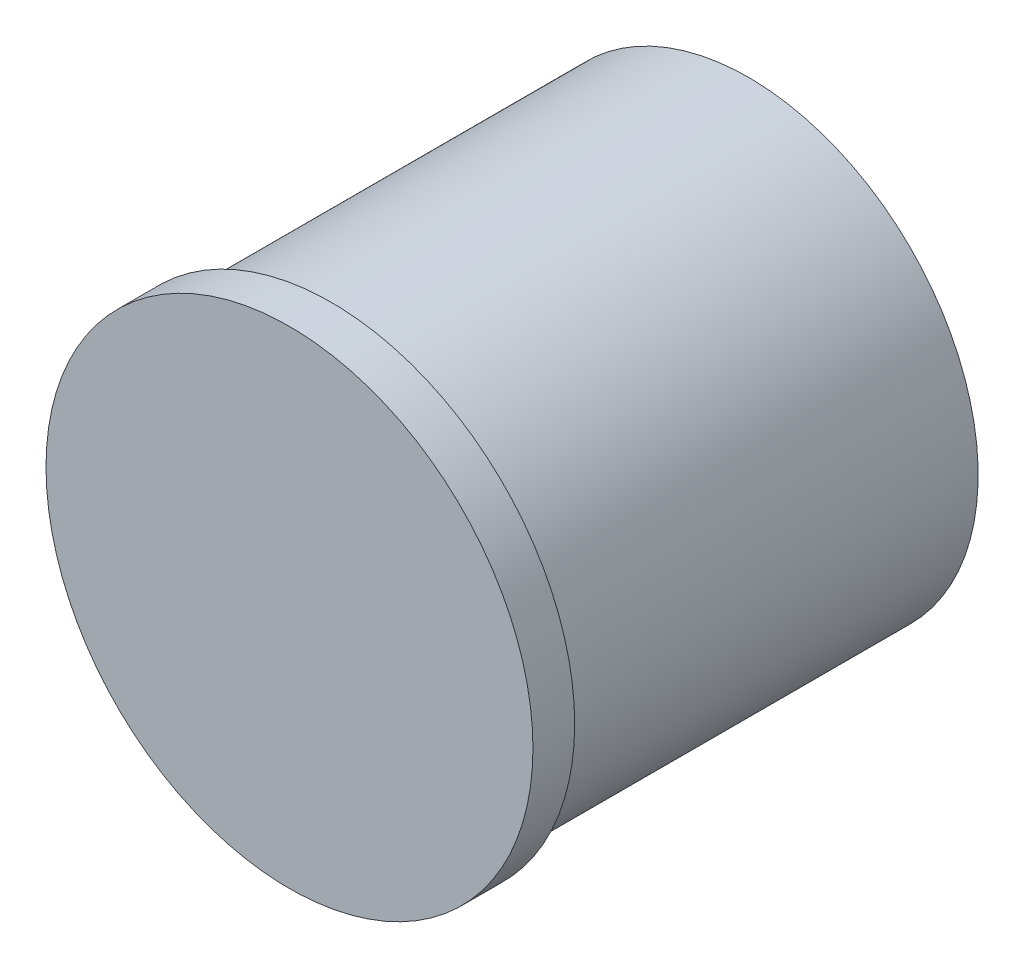
ISO-10303-21;
HEADER;
FILE_DESCRIPTION(('STEP AP214'),'2;1');
FILE_NAME('part.step','',(''),(''),'','','');
FILE_SCHEMA(('AUTOMOTIVE_DESIGN { 1 0 10303 214 1 1 1 1 }'));
ENDSEC;
DATA;
#1=APPLICATION_CONTEXT('core data for automotive mechanical design processes');
#2=APPLICATION_PROTOCOL_DEFINITION('international standard','automotive_design',2000,#1);
#3=PRODUCT_CONTEXT('',#1,'mechanical');
#4=PRODUCT('Part','Part','',(#3));
#5=PRODUCT_RELATED_PRODUCT_CATEGORY('part','',(#4));
#6=PRODUCT_DEFINITION_FORMATION('','',#4);
#7=PRODUCT_DEFINITION_CONTEXT('part definition',#1,'design');
#8=PRODUCT_DEFINITION('design','',#6,#7);
#9=PRODUCT_DEFINITION_SHAPE('','',#8);
#10=(LENGTH_UNIT() NAMED_UNIT(*) SI_UNIT(.MILLI.,.METRE.));
#11=(NAMED_UNIT(*) PLANE_ANGLE_UNIT() SI_UNIT($,.RADIAN.));
#12=(NAMED_UNIT(*) SI_UNIT($,.STERADIAN.) SOLID_ANGLE_UNIT());
#13=UNCERTAINTY_MEASURE_WITH_UNIT(LENGTH_MEASURE(1.E-05),#10,'distance_accuracy_value','');
#14=(GEOMETRIC_REPRESENTATION_CONTEXT(3) GLOBAL_UNCERTAINTY_ASSIGNED_CONTEXT((#13)) GLOBAL_UNIT_ASSIGNED_CONTEXT((#10,
#11,#12)) REPRESENTATION_CONTEXT('',''));
#15=CARTESIAN_POINT('',(0.,0.,0.));
#16=DIRECTION('',(0.,0.,1.));
#17=DIRECTION('',(1.,0.,0.));
#18=AXIS2_PLACEMENT_3D('',#15,#16,#17);
#19=CARTESIAN_POINT('',(0.,0.,0.));
#20=DIRECTION('',(0.,0.,-1.));
#21=DIRECTION('',(-1.,0.,0.));
#22=AXIS2_PLACEMENT_3D('',#19,#20,#21);
#23=CYLINDRICAL_SURFACE('',#22,16.5);
#24=CARTESIAN_POINT('',(0.,0.,15.));
#25=DIRECTION('',(0.,0.,-1.));
#26=DIRECTION('',(-1.,0.,0.));
#27=AXIS2_PLACEMENT_3D('',#24,#25,#26);
#28=CIRCLE('',#27,16.5);
#29=CARTESIAN_POINT('',(-16.5,0.,15.));
#30=VERTEX_POINT('',#29);
#31=EDGE_CURVE('E36',#30,#30,#28,.T.);
#32=ORIENTED_EDGE('',*,*,#31,.T.);
#33=EDGE_LOOP('',(#32));
#34=FACE_BOUND('',#33,.T.);
#35=CARTESIAN_POINT('',(0.,0.,-15.));
#36=DIRECTION('',(0.,0.,-1.));
#37=DIRECTION('',(-1.,0.,0.));
#38=AXIS2_PLACEMENT_3D('',#35,#36,#37);
#39=CIRCLE('',#38,16.5);
#40=CARTESIAN_POINT('',(-16.5,0.,-15.));
#41=VERTEX_POINT('',#40);
#42=EDGE_CURVE('E10',#41,#41,#39,.T.);
#43=ORIENTED_EDGE('',*,*,#42,.F.);
#44=EDGE_LOOP('',(#43));
#45=FACE_BOUND('',#44,.T.);
#46=ADVANCED_FACE('F33',(#34,#45),#23,.T.);
#47=CARTESIAN_POINT('',(0.,0.,-15.));
#48=DIRECTION('',(0.,0.,-1.));
#49=DIRECTION('',(-1.,0.,0.));
#50=AXIS2_PLACEMENT_3D('',#47,#48,#49);
#51=PLANE('',#50);
#52=ORIENTED_EDGE('',*,*,#42,.T.);
#53=EDGE_LOOP('',(#52));
#54=FACE_BOUND('',#53,.T.);
#55=CARTESIAN_POINT('',(0.,0.,-15.));
#56=DIRECTION('',(0.,0.,-1.));
#57=DIRECTION('',(-1.,0.,0.));
#58=AXIS2_PLACEMENT_3D('',#55,#56,#57);
#59=CIRCLE('',#58,13.5);
#60=CARTESIAN_POINT('',(-13.5,0.,-15.));
#61=VERTEX_POINT('',#60);
#62=EDGE_CURVE('E40',#61,#61,#59,.T.);
#63=ORIENTED_EDGE('',*,*,#62,.F.);
#64=EDGE_LOOP('',(#63));
#65=FACE_BOUND('',#64,.T.);
#66=ADVANCED_FACE('F82',(#54,#65),#51,.T.);
#67=CARTESIAN_POINT('',(0.,0.,0.));
#68=DIRECTION('',(0.,0.,-1.));
#69=DIRECTION('',(-1.,0.,0.));
#70=AXIS2_PLACEMENT_3D('',#67,#68,#69);
#71=CYLINDRICAL_SURFACE('',#70,13.5);
#72=CARTESIAN_POINT('',(0.,0.,12.));
#73=DIRECTION('',(0.,0.,-1.));
#74=DIRECTION('',(-1.,0.,0.));
#75=AXIS2_PLACEMENT_3D('',#72,#73,#74);
#76=CIRCLE('',#75,13.5);
#77=CARTESIAN_POINT('',(-13.5,0.,12.));
#78=VERTEX_POINT('',#77);
#79=EDGE_CURVE('E44',#78,#78,#76,.T.);
#80=ORIENTED_EDGE('',*,*,#79,.F.);
#81=EDGE_LOOP('',(#80));
#82=FACE_BOUND('',#81,.T.);
#83=ORIENTED_EDGE('',*,*,#62,.T.);
#84=EDGE_LOOP('',(#83));
#85=FACE_BOUND('',#84,.T.);
#86=ADVANCED_FACE('F78',(#82,#85),#71,.F.);
#87=CARTESIAN_POINT('',(0.,0.,12.));
#88=DIRECTION('',(0.,0.,-1.));
#89=DIRECTION('',(-1.,0.,0.));
#90=AXIS2_PLACEMENT_3D('',#87,#88,#89);
#91=PLANE('',#90);
#92=ORIENTED_EDGE('',*,*,#79,.T.);
#93=EDGE_LOOP('',(#92));
#94=FACE_BOUND('',#93,.T.);
#95=ADVANCED_FACE('F70',(#94),#91,.T.);
#96=CARTESIAN_POINT('',(0.,0.,18.));
#97=DIRECTION('',(0.,0.,-1.));
#98=DIRECTION('',(-1.,0.,0.));
#99=AXIS2_PLACEMENT_3D('',#96,#97,#98);
#100=CYLINDRICAL_SURFACE('',#99,17.5);
#101=CARTESIAN_POINT('',(0.,0.,18.));
#102=DIRECTION('',(0.,0.,1.));
#103=DIRECTION('',(1.,0.,0.));
#104=AXIS2_PLACEMENT_3D('',#101,#102,#103);
#105=CIRCLE('',#104,17.5);
#106=CARTESIAN_POINT('',(17.5,0.,18.));
#107=VERTEX_POINT('',#106);
#108=EDGE_CURVE('E52',#107,#107,#105,.T.);
#109=ORIENTED_EDGE('',*,*,#108,.F.);
#110=EDGE_LOOP('',(#109));
#111=FACE_BOUND('',#110,.T.);
#112=CARTESIAN_POINT('',(0.,0.,15.));
#113=DIRECTION('',(0.,0.,1.));
#114=DIRECTION('',(1.,0.,0.));
#115=AXIS2_PLACEMENT_3D('',#112,#113,#114);
#116=CIRCLE('',#115,17.5);
#117=CARTESIAN_POINT('',(17.5,0.,15.));
#118=VERTEX_POINT('',#117);
#119=EDGE_CURVE('E49',#118,#118,#116,.T.);
#120=ORIENTED_EDGE('',*,*,#119,.T.);
#121=EDGE_LOOP('',(#120));
#122=FACE_BOUND('',#121,.T.);
#123=ADVANCED_FACE('F68',(#111,#122),#100,.T.);
#124=CARTESIAN_POINT('',(0.,0.,18.));
#125=DIRECTION('',(0.,0.,1.));
#126=DIRECTION('',(1.,0.,0.));
#127=AXIS2_PLACEMENT_3D('',#124,#125,#126);
#128=PLANE('',#127);
#129=ORIENTED_EDGE('',*,*,#108,.T.);
#130=EDGE_LOOP('',(#129));
#131=FACE_BOUND('',#130,.T.);
#132=ADVANCED_FACE('F64',(#131),#128,.T.);
#133=CARTESIAN_POINT('',(0.,0.,15.));
#134=DIRECTION('',(0.,0.,1.));
#135=DIRECTION('',(1.,0.,0.));
#136=AXIS2_PLACEMENT_3D('',#133,#134,#135);
#137=PLANE('',#136);
#138=ORIENTED_EDGE('',*,*,#31,.F.);
#139=EDGE_LOOP('',(#138));
#140=FACE_BOUND('',#139,.T.);
#141=ORIENTED_EDGE('',*,*,#119,.F.);
#142=EDGE_LOOP('',(#141));
#143=FACE_BOUND('',#142,.T.);
#144=ADVANCED_FACE('F61',(#140,#143),#137,.F.);
#145=CLOSED_SHELL('',(#46,#66,#86,#95,#123,#132,#144));
#146=MANIFOLD_SOLID_BREP('B2',#145);
#147=ADVANCED_BREP_SHAPE_REPRESENTATION('',(#18,#146),#14);
#148=SHAPE_DEFINITION_REPRESENTATION(#9,#147);
ENDSEC;
END-ISO-10303-21;
